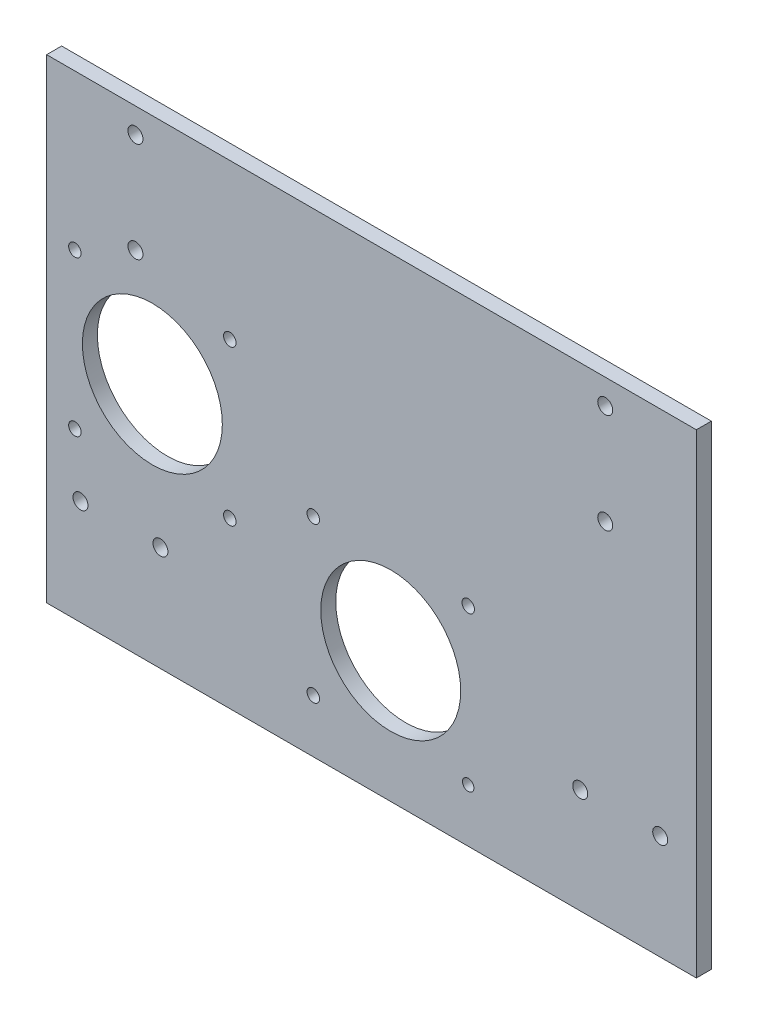
ISO-10303-21;
HEADER;
FILE_DESCRIPTION(('STEP AP214'),'2;1');
FILE_NAME('part.step','',(''),(''),'','','');
FILE_SCHEMA(('AUTOMOTIVE_DESIGN { 1 0 10303 214 1 1 1 1 }'));
ENDSEC;
DATA;
#1=APPLICATION_CONTEXT('core data for automotive mechanical design processes');
#2=APPLICATION_PROTOCOL_DEFINITION('international standard','automotive_design',2000,#1);
#3=PRODUCT_CONTEXT('',#1,'mechanical');
#4=PRODUCT('Part','Part','',(#3));
#5=PRODUCT_RELATED_PRODUCT_CATEGORY('part','',(#4));
#6=PRODUCT_DEFINITION_FORMATION('','',#4);
#7=PRODUCT_DEFINITION_CONTEXT('part definition',#1,'design');
#8=PRODUCT_DEFINITION('design','',#6,#7);
#9=PRODUCT_DEFINITION_SHAPE('','',#8);
#10=(LENGTH_UNIT() NAMED_UNIT(*) SI_UNIT(.MILLI.,.METRE.));
#11=(NAMED_UNIT(*) PLANE_ANGLE_UNIT() SI_UNIT($,.RADIAN.));
#12=(NAMED_UNIT(*) SI_UNIT($,.STERADIAN.) SOLID_ANGLE_UNIT());
#13=UNCERTAINTY_MEASURE_WITH_UNIT(LENGTH_MEASURE(1.E-05),#10,'distance_accuracy_value','');
#14=(GEOMETRIC_REPRESENTATION_CONTEXT(3) GLOBAL_UNCERTAINTY_ASSIGNED_CONTEXT((#13)) GLOBAL_UNIT_ASSIGNED_CONTEXT((#10,
#11,#12)) REPRESENTATION_CONTEXT('',''));
#15=CARTESIAN_POINT('',(0.,0.,0.));
#16=DIRECTION('',(0.,0.,1.));
#17=DIRECTION('',(1.,0.,0.));
#18=AXIS2_PLACEMENT_3D('',#15,#16,#17);
#19=CARTESIAN_POINT('',(-65.,-47.5,3.));
#20=DIRECTION('',(1.,0.,0.));
#21=DIRECTION('',(0.,0.,-1.));
#22=AXIS2_PLACEMENT_3D('',#19,#20,#21);
#23=PLANE('',#22);
#24=DIRECTION('',(0.,-1.,0.));
#25=VECTOR('',#24,1.);
#26=CARTESIAN_POINT('',(-65.,-47.5,0.));
#27=LINE('',#26,#25);
#28=CARTESIAN_POINT('',(-65.,47.5,0.));
#29=VERTEX_POINT('',#28);
#30=CARTESIAN_POINT('',(-65.,-47.5,0.));
#31=VERTEX_POINT('',#30);
#32=EDGE_CURVE('E113',#29,#31,#27,.T.);
#33=ORIENTED_EDGE('',*,*,#32,.T.);
#34=DIRECTION('',(0.,0.,-1.));
#35=VECTOR('',#34,1.);
#36=CARTESIAN_POINT('',(-65.,-47.5,3.));
#37=LINE('',#36,#35);
#38=CARTESIAN_POINT('',(-65.,-47.5,3.));
#39=VERTEX_POINT('',#38);
#40=EDGE_CURVE('E11',#39,#31,#37,.T.);
#41=ORIENTED_EDGE('',*,*,#40,.F.);
#42=DIRECTION('',(0.,-1.,0.));
#43=VECTOR('',#42,1.);
#44=CARTESIAN_POINT('',(-65.,-47.5,3.));
#45=LINE('',#44,#43);
#46=CARTESIAN_POINT('',(-65.,47.5,3.));
#47=VERTEX_POINT('',#46);
#48=EDGE_CURVE('E96',#47,#39,#45,.T.);
#49=ORIENTED_EDGE('',*,*,#48,.F.);
#50=DIRECTION('',(0.,0.,-1.));
#51=VECTOR('',#50,1.);
#52=CARTESIAN_POINT('',(-65.,47.5,3.));
#53=LINE('',#52,#51);
#54=EDGE_CURVE('E109',#47,#29,#53,.T.);
#55=ORIENTED_EDGE('',*,*,#54,.T.);
#56=EDGE_LOOP('',(#33,#41,#49,#55));
#57=FACE_BOUND('',#56,.T.);
#58=ADVANCED_FACE('F42',(#57),#23,.F.);
#59=CARTESIAN_POINT('',(65.,-47.5,3.));
#60=DIRECTION('',(0.,1.,0.));
#61=DIRECTION('',(-1.,0.,0.));
#62=AXIS2_PLACEMENT_3D('',#59,#60,#61);
#63=PLANE('',#62);
#64=DIRECTION('',(1.,0.,0.));
#65=VECTOR('',#64,1.);
#66=CARTESIAN_POINT('',(65.,-47.5,0.));
#67=LINE('',#66,#65);
#68=CARTESIAN_POINT('',(65.,-47.5,0.));
#69=VERTEX_POINT('',#68);
#70=EDGE_CURVE('E101',#31,#69,#67,.T.);
#71=ORIENTED_EDGE('',*,*,#70,.T.);
#72=DIRECTION('',(0.,0.,-1.));
#73=VECTOR('',#72,1.);
#74=CARTESIAN_POINT('',(65.,-47.5,3.));
#75=LINE('',#74,#73);
#76=CARTESIAN_POINT('',(65.,-47.5,3.));
#77=VERTEX_POINT('',#76);
#78=EDGE_CURVE('E52',#77,#69,#75,.T.);
#79=ORIENTED_EDGE('',*,*,#78,.F.);
#80=DIRECTION('',(1.,0.,0.));
#81=VECTOR('',#80,1.);
#82=CARTESIAN_POINT('',(65.,-47.5,3.));
#83=LINE('',#82,#81);
#84=EDGE_CURVE('E91',#39,#77,#83,.T.);
#85=ORIENTED_EDGE('',*,*,#84,.F.);
#86=ORIENTED_EDGE('',*,*,#40,.T.);
#87=EDGE_LOOP('',(#71,#79,#85,#86));
#88=FACE_BOUND('',#87,.T.);
#89=ADVANCED_FACE('F100',(#88),#63,.F.);
#90=CARTESIAN_POINT('',(65.,-47.5,3.));
#91=DIRECTION('',(-1.,0.,0.));
#92=DIRECTION('',(0.,0.,1.));
#93=AXIS2_PLACEMENT_3D('',#90,#91,#92);
#94=PLANE('',#93);
#95=DIRECTION('',(0.,1.,0.));
#96=VECTOR('',#95,1.);
#97=CARTESIAN_POINT('',(65.,-47.5,0.));
#98=LINE('',#97,#96);
#99=CARTESIAN_POINT('',(65.,47.5,0.));
#100=VERTEX_POINT('',#99);
#101=EDGE_CURVE('E78',#69,#100,#98,.T.);
#102=ORIENTED_EDGE('',*,*,#101,.T.);
#103=DIRECTION('',(0.,0.,-1.));
#104=VECTOR('',#103,1.);
#105=CARTESIAN_POINT('',(65.,47.5,3.));
#106=LINE('',#105,#104);
#107=CARTESIAN_POINT('',(65.,47.5,3.));
#108=VERTEX_POINT('',#107);
#109=EDGE_CURVE('E103',#108,#100,#106,.T.);
#110=ORIENTED_EDGE('',*,*,#109,.F.);
#111=DIRECTION('',(0.,1.,0.));
#112=VECTOR('',#111,1.);
#113=CARTESIAN_POINT('',(65.,-47.5,3.));
#114=LINE('',#113,#112);
#115=EDGE_CURVE('E94',#77,#108,#114,.T.);
#116=ORIENTED_EDGE('',*,*,#115,.F.);
#117=ORIENTED_EDGE('',*,*,#78,.T.);
#118=EDGE_LOOP('',(#102,#110,#116,#117));
#119=FACE_BOUND('',#118,.T.);
#120=ADVANCED_FACE('F105',(#119),#94,.F.);
#121=CARTESIAN_POINT('',(65.,47.5,3.));
#122=DIRECTION('',(0.,-1.,0.));
#123=DIRECTION('',(1.,0.,0.));
#124=AXIS2_PLACEMENT_3D('',#121,#122,#123);
#125=PLANE('',#124);
#126=DIRECTION('',(-1.,0.,0.));
#127=VECTOR('',#126,1.);
#128=CARTESIAN_POINT('',(65.,47.5,0.));
#129=LINE('',#128,#127);
#130=EDGE_CURVE('E84',#100,#29,#129,.T.);
#131=ORIENTED_EDGE('',*,*,#130,.T.);
#132=ORIENTED_EDGE('',*,*,#54,.F.);
#133=DIRECTION('',(-1.,0.,0.));
#134=VECTOR('',#133,1.);
#135=CARTESIAN_POINT('',(65.,47.5,3.));
#136=LINE('',#135,#134);
#137=EDGE_CURVE('E61',#108,#47,#136,.T.);
#138=ORIENTED_EDGE('',*,*,#137,.F.);
#139=ORIENTED_EDGE('',*,*,#109,.T.);
#140=EDGE_LOOP('',(#131,#132,#138,#139));
#141=FACE_BOUND('',#140,.T.);
#142=ADVANCED_FACE('F252',(#141),#125,.F.);
#143=CARTESIAN_POINT('',(0.,0.,3.));
#144=DIRECTION('',(0.,0.,1.));
#145=DIRECTION('',(1.,0.,0.));
#146=AXIS2_PLACEMENT_3D('',#143,#144,#145);
#147=PLANE('',#146);
#148=CARTESIAN_POINT('',(-11.65,-5.85000000000109,3.));
#149=DIRECTION('',(0.,0.,1.));
#150=DIRECTION('',(1.,0.,0.));
#151=AXIS2_PLACEMENT_3D('',#148,#149,#150);
#152=CIRCLE('',#151,1.24999999999999);
#153=CARTESIAN_POINT('',(-10.4,-5.85000000000109,3.));
#154=VERTEX_POINT('',#153);
#155=EDGE_CURVE('E539',#154,#154,#152,.T.);
#156=ORIENTED_EDGE('',*,*,#155,.F.);
#157=EDGE_LOOP('',(#156));
#158=FACE_BOUND('',#157,.T.);
#159=CARTESIAN_POINT('',(-28.35,-14.5033003747531,3.));
#160=DIRECTION('',(0.,0.,1.));
#161=DIRECTION('',(1.,0.,0.));
#162=AXIS2_PLACEMENT_3D('',#159,#160,#161);
#163=CIRCLE('',#162,1.24999999999999);
#164=CARTESIAN_POINT('',(-27.1,-14.5033003747531,3.));
#165=VERTEX_POINT('',#164);
#166=EDGE_CURVE('E541',#165,#165,#163,.T.);
#167=ORIENTED_EDGE('',*,*,#166,.F.);
#168=EDGE_LOOP('',(#167));
#169=FACE_BOUND('',#168,.T.);
#170=CARTESIAN_POINT('',(-59.35,-14.5033003747531,3.));
#171=DIRECTION('',(0.,0.,1.));
#172=DIRECTION('',(1.,0.,0.));
#173=AXIS2_PLACEMENT_3D('',#170,#171,#172);
#174=CIRCLE('',#173,1.24999999999999);
#175=CARTESIAN_POINT('',(-58.1,-14.5033003747531,3.));
#176=VERTEX_POINT('',#175);
#177=EDGE_CURVE('E547',#176,#176,#174,.T.);
#178=ORIENTED_EDGE('',*,*,#177,.F.);
#179=EDGE_LOOP('',(#178));
#180=FACE_BOUND('',#179,.T.);
#181=CARTESIAN_POINT('',(-28.35,16.4966996252469,3.));
#182=DIRECTION('',(0.,0.,1.));
#183=DIRECTION('',(1.,0.,0.));
#184=AXIS2_PLACEMENT_3D('',#181,#182,#183);
#185=CIRCLE('',#184,1.24999999999999);
#186=CARTESIAN_POINT('',(-27.1,16.4966996252469,3.));
#187=VERTEX_POINT('',#186);
#188=EDGE_CURVE('E554',#187,#187,#185,.T.);
#189=ORIENTED_EDGE('',*,*,#188,.F.);
#190=EDGE_LOOP('',(#189));
#191=FACE_BOUND('',#190,.T.);
#192=CARTESIAN_POINT('',(19.35,-5.85000000000108,3.));
#193=DIRECTION('',(0.,0.,1.));
#194=DIRECTION('',(1.,0.,0.));
#195=AXIS2_PLACEMENT_3D('',#192,#193,#194);
#196=CIRCLE('',#195,1.24999999999999);
#197=CARTESIAN_POINT('',(20.6,-5.85000000000108,3.));
#198=VERTEX_POINT('',#197);
#199=EDGE_CURVE('E542',#198,#198,#196,.T.);
#200=ORIENTED_EDGE('',*,*,#199,.F.);
#201=EDGE_LOOP('',(#200));
#202=FACE_BOUND('',#201,.T.);
#203=CARTESIAN_POINT('',(19.35,-36.8500000000011,3.));
#204=DIRECTION('',(0.,0.,1.));
#205=DIRECTION('',(1.,0.,0.));
#206=AXIS2_PLACEMENT_3D('',#203,#204,#205);
#207=CIRCLE('',#206,1.1455222308157);
#208=CARTESIAN_POINT('',(20.4955222308157,-36.8500000000011,3.));
#209=VERTEX_POINT('',#208);
#210=EDGE_CURVE('E550',#209,#209,#207,.T.);
#211=ORIENTED_EDGE('',*,*,#210,.F.);
#212=EDGE_LOOP('',(#211));
#213=FACE_BOUND('',#212,.T.);
#214=CARTESIAN_POINT('',(-11.65,-36.8500000000011,3.));
#215=DIRECTION('',(0.,0.,1.));
#216=DIRECTION('',(1.,0.,0.));
#217=AXIS2_PLACEMENT_3D('',#214,#215,#216);
#218=CIRCLE('',#217,1.25);
#219=CARTESIAN_POINT('',(-10.4,-36.8500000000011,3.));
#220=VERTEX_POINT('',#219);
#221=EDGE_CURVE('E616',#220,#220,#218,.T.);
#222=ORIENTED_EDGE('',*,*,#221,.F.);
#223=EDGE_LOOP('',(#222));
#224=FACE_BOUND('',#223,.T.);
#225=CARTESIAN_POINT('',(-59.35,16.4966996252469,3.));
#226=DIRECTION('',(0.,0.,1.));
#227=DIRECTION('',(1.,0.,0.));
#228=AXIS2_PLACEMENT_3D('',#225,#226,#227);
#229=CIRCLE('',#228,1.24999999999999);
#230=CARTESIAN_POINT('',(-58.1,16.4966996252469,3.));
#231=VERTEX_POINT('',#230);
#232=EDGE_CURVE('E133',#231,#231,#229,.T.);
#233=ORIENTED_EDGE('',*,*,#232,.F.);
#234=EDGE_LOOP('',(#233));
#235=FACE_BOUND('',#234,.T.);
#236=CARTESIAN_POINT('',(3.84999999999999,-21.3500000000588,3.));
#237=DIRECTION('',(0.,0.,1.));
#238=DIRECTION('',(1.,0.,0.));
#239=AXIS2_PLACEMENT_3D('',#236,#237,#238);
#240=CIRCLE('',#239,14.);
#241=CARTESIAN_POINT('',(17.85,-21.3500000000588,3.));
#242=VERTEX_POINT('',#241);
#243=EDGE_CURVE('E177',#242,#242,#240,.T.);
#244=ORIENTED_EDGE('',*,*,#243,.F.);
#245=EDGE_LOOP('',(#244));
#246=FACE_BOUND('',#245,.T.);
#247=CARTESIAN_POINT('',(-43.85,0.99669962524906,3.));
#248=DIRECTION('',(0.,0.,1.));
#249=DIRECTION('',(1.,0.,0.));
#250=AXIS2_PLACEMENT_3D('',#247,#248,#249);
#251=CIRCLE('',#250,14.);
#252=CARTESIAN_POINT('',(-29.85,0.99669962524906,3.));
#253=VERTEX_POINT('',#252);
#254=EDGE_CURVE('E170',#253,#253,#251,.T.);
#255=ORIENTED_EDGE('',*,*,#254,.F.);
#256=EDGE_LOOP('',(#255));
#257=FACE_BOUND('',#256,.T.);
#258=CARTESIAN_POINT('',(46.7671126155352,22.5,3.));
#259=DIRECTION('',(0.,0.,1.));
#260=DIRECTION('',(1.,0.,0.));
#261=AXIS2_PLACEMENT_3D('',#258,#259,#260);
#262=CIRCLE('',#261,1.5);
#263=CARTESIAN_POINT('',(48.2671126155352,22.5,3.));
#264=VERTEX_POINT('',#263);
#265=EDGE_CURVE('E209',#264,#264,#262,.T.);
#266=ORIENTED_EDGE('',*,*,#265,.F.);
#267=EDGE_LOOP('',(#266));
#268=FACE_BOUND('',#267,.T.);
#269=CARTESIAN_POINT('',(-47.2328873844649,42.5,3.));
#270=DIRECTION('',(0.,0.,1.));
#271=DIRECTION('',(1.,0.,0.));
#272=AXIS2_PLACEMENT_3D('',#269,#270,#271);
#273=CIRCLE('',#272,1.5);
#274=CARTESIAN_POINT('',(-45.7328873844649,42.5,3.));
#275=VERTEX_POINT('',#274);
#276=EDGE_CURVE('E205',#275,#275,#273,.T.);
#277=ORIENTED_EDGE('',*,*,#276,.F.);
#278=EDGE_LOOP('',(#277));
#279=FACE_BOUND('',#278,.T.);
#280=CARTESIAN_POINT('',(-47.2328873844649,22.5,3.));
#281=DIRECTION('',(0.,0.,1.));
#282=DIRECTION('',(1.,0.,0.));
#283=AXIS2_PLACEMENT_3D('',#280,#281,#282);
#284=CIRCLE('',#283,1.5);
#285=CARTESIAN_POINT('',(-45.7328873844649,22.5,3.));
#286=VERTEX_POINT('',#285);
#287=EDGE_CURVE('E201',#286,#286,#284,.T.);
#288=ORIENTED_EDGE('',*,*,#287,.F.);
#289=EDGE_LOOP('',(#288));
#290=FACE_BOUND('',#289,.T.);
#291=CARTESIAN_POINT('',(46.7671126155352,42.5,3.));
#292=DIRECTION('',(0.,0.,1.));
#293=DIRECTION('',(1.,0.,0.));
#294=AXIS2_PLACEMENT_3D('',#291,#292,#293);
#295=CIRCLE('',#294,1.5);
#296=CARTESIAN_POINT('',(48.2671126155352,42.5,3.));
#297=VERTEX_POINT('',#296);
#298=EDGE_CURVE('E197',#297,#297,#295,.T.);
#299=ORIENTED_EDGE('',*,*,#298,.F.);
#300=EDGE_LOOP('',(#299));
#301=FACE_BOUND('',#300,.T.);
#302=CARTESIAN_POINT('',(57.7671126155351,-26.5,3.));
#303=DIRECTION('',(0.,0.,1.));
#304=DIRECTION('',(1.,0.,0.));
#305=AXIS2_PLACEMENT_3D('',#302,#303,#304);
#306=CIRCLE('',#305,1.5);
#307=CARTESIAN_POINT('',(59.2671126155351,-26.5,3.));
#308=VERTEX_POINT('',#307);
#309=EDGE_CURVE('E117',#308,#308,#306,.T.);
#310=ORIENTED_EDGE('',*,*,#309,.F.);
#311=EDGE_LOOP('',(#310));
#312=FACE_BOUND('',#311,.T.);
#313=CARTESIAN_POINT('',(41.7671126155351,-26.5,3.));
#314=DIRECTION('',(0.,0.,1.));
#315=DIRECTION('',(1.,0.,0.));
#316=AXIS2_PLACEMENT_3D('',#313,#314,#315);
#317=CIRCLE('',#316,1.5);
#318=CARTESIAN_POINT('',(43.2671126155351,-26.5,3.));
#319=VERTEX_POINT('',#318);
#320=EDGE_CURVE('E237',#319,#319,#317,.T.);
#321=ORIENTED_EDGE('',*,*,#320,.F.);
#322=EDGE_LOOP('',(#321));
#323=FACE_BOUND('',#322,.T.);
#324=CARTESIAN_POINT('',(-42.2328873844649,-26.5,3.));
#325=DIRECTION('',(0.,0.,1.));
#326=DIRECTION('',(1.,0.,0.));
#327=AXIS2_PLACEMENT_3D('',#324,#325,#326);
#328=CIRCLE('',#327,1.5);
#329=CARTESIAN_POINT('',(-40.7328873844649,-26.5,3.));
#330=VERTEX_POINT('',#329);
#331=EDGE_CURVE('E233',#330,#330,#328,.T.);
#332=ORIENTED_EDGE('',*,*,#331,.F.);
#333=EDGE_LOOP('',(#332));
#334=FACE_BOUND('',#333,.T.);
#335=CARTESIAN_POINT('',(-58.2328873844649,-26.5,3.));
#336=DIRECTION('',(0.,0.,1.));
#337=DIRECTION('',(1.,0.,0.));
#338=AXIS2_PLACEMENT_3D('',#335,#336,#337);
#339=CIRCLE('',#338,1.5);
#340=CARTESIAN_POINT('',(-56.7328873844649,-26.5,3.));
#341=VERTEX_POINT('',#340);
#342=EDGE_CURVE('E218',#341,#341,#339,.T.);
#343=ORIENTED_EDGE('',*,*,#342,.F.);
#344=EDGE_LOOP('',(#343));
#345=FACE_BOUND('',#344,.T.);
#346=ORIENTED_EDGE('',*,*,#48,.T.);
#347=ORIENTED_EDGE('',*,*,#84,.T.);
#348=ORIENTED_EDGE('',*,*,#115,.T.);
#349=ORIENTED_EDGE('',*,*,#137,.T.);
#350=EDGE_LOOP('',(#346,#347,#348,#349));
#351=FACE_BOUND('',#350,.T.);
#352=ADVANCED_FACE('F92',(#158,#169,#180,#191,#202,#213,#224,#235,#246,#257,#268,#279,#290,#301,
#312,#323,#334,#345,#351),#147,.T.);
#353=CARTESIAN_POINT('',(0.,0.,0.));
#354=DIRECTION('',(0.,0.,1.));
#355=DIRECTION('',(1.,0.,0.));
#356=AXIS2_PLACEMENT_3D('',#353,#354,#355);
#357=PLANE('',#356);
#358=CARTESIAN_POINT('',(-11.65,-5.85000000000109,0.));
#359=DIRECTION('',(0.,0.,1.));
#360=DIRECTION('',(1.,0.,0.));
#361=AXIS2_PLACEMENT_3D('',#358,#359,#360);
#362=CIRCLE('',#361,1.24999999999999);
#363=CARTESIAN_POINT('',(-10.4,-5.85000000000109,0.));
#364=VERTEX_POINT('',#363);
#365=EDGE_CURVE('E45',#364,#364,#362,.T.);
#366=ORIENTED_EDGE('',*,*,#365,.T.);
#367=EDGE_LOOP('',(#366));
#368=FACE_BOUND('',#367,.T.);
#369=CARTESIAN_POINT('',(-28.35,-14.5033003747531,0.));
#370=DIRECTION('',(0.,0.,1.));
#371=DIRECTION('',(1.,0.,0.));
#372=AXIS2_PLACEMENT_3D('',#369,#370,#371);
#373=CIRCLE('',#372,1.24999999999999);
#374=CARTESIAN_POINT('',(-27.1,-14.5033003747531,0.));
#375=VERTEX_POINT('',#374);
#376=EDGE_CURVE('E152',#375,#375,#373,.T.);
#377=ORIENTED_EDGE('',*,*,#376,.T.);
#378=EDGE_LOOP('',(#377));
#379=FACE_BOUND('',#378,.T.);
#380=CARTESIAN_POINT('',(-59.35,-14.5033003747531,0.));
#381=DIRECTION('',(0.,0.,1.));
#382=DIRECTION('',(1.,0.,0.));
#383=AXIS2_PLACEMENT_3D('',#380,#381,#382);
#384=CIRCLE('',#383,1.24999999999999);
#385=CARTESIAN_POINT('',(-58.1,-14.5033003747531,0.));
#386=VERTEX_POINT('',#385);
#387=EDGE_CURVE('E149',#386,#386,#384,.T.);
#388=ORIENTED_EDGE('',*,*,#387,.T.);
#389=EDGE_LOOP('',(#388));
#390=FACE_BOUND('',#389,.T.);
#391=CARTESIAN_POINT('',(-28.35,16.4966996252469,0.));
#392=DIRECTION('',(0.,0.,1.));
#393=DIRECTION('',(1.,0.,0.));
#394=AXIS2_PLACEMENT_3D('',#391,#392,#393);
#395=CIRCLE('',#394,1.24999999999999);
#396=CARTESIAN_POINT('',(-27.1,16.4966996252469,0.));
#397=VERTEX_POINT('',#396);
#398=EDGE_CURVE('E145',#397,#397,#395,.T.);
#399=ORIENTED_EDGE('',*,*,#398,.T.);
#400=EDGE_LOOP('',(#399));
#401=FACE_BOUND('',#400,.T.);
#402=CARTESIAN_POINT('',(19.35,-5.85000000000108,0.));
#403=DIRECTION('',(0.,0.,1.));
#404=DIRECTION('',(1.,0.,0.));
#405=AXIS2_PLACEMENT_3D('',#402,#403,#404);
#406=CIRCLE('',#405,1.24999999999999);
#407=CARTESIAN_POINT('',(20.6,-5.85000000000108,0.));
#408=VERTEX_POINT('',#407);
#409=EDGE_CURVE('E141',#408,#408,#406,.T.);
#410=ORIENTED_EDGE('',*,*,#409,.T.);
#411=EDGE_LOOP('',(#410));
#412=FACE_BOUND('',#411,.T.);
#413=CARTESIAN_POINT('',(19.35,-36.8500000000011,0.));
#414=DIRECTION('',(0.,0.,1.));
#415=DIRECTION('',(1.,0.,0.));
#416=AXIS2_PLACEMENT_3D('',#413,#414,#415);
#417=CIRCLE('',#416,1.1455222308157);
#418=CARTESIAN_POINT('',(20.4955222308157,-36.8500000000011,0.));
#419=VERTEX_POINT('',#418);
#420=EDGE_CURVE('E137',#419,#419,#417,.T.);
#421=ORIENTED_EDGE('',*,*,#420,.T.);
#422=EDGE_LOOP('',(#421));
#423=FACE_BOUND('',#422,.T.);
#424=CARTESIAN_POINT('',(-11.65,-36.8500000000011,0.));
#425=DIRECTION('',(0.,0.,1.));
#426=DIRECTION('',(1.,0.,0.));
#427=AXIS2_PLACEMENT_3D('',#424,#425,#426);
#428=CIRCLE('',#427,1.25);
#429=CARTESIAN_POINT('',(-10.4,-36.8500000000011,0.));
#430=VERTEX_POINT('',#429);
#431=EDGE_CURVE('E132',#430,#430,#428,.T.);
#432=ORIENTED_EDGE('',*,*,#431,.T.);
#433=EDGE_LOOP('',(#432));
#434=FACE_BOUND('',#433,.T.);
#435=CARTESIAN_POINT('',(-59.35,16.4966996252469,0.));
#436=DIRECTION('',(0.,0.,1.));
#437=DIRECTION('',(1.,0.,0.));
#438=AXIS2_PLACEMENT_3D('',#435,#436,#437);
#439=CIRCLE('',#438,1.24999999999999);
#440=CARTESIAN_POINT('',(-58.1,16.4966996252469,0.));
#441=VERTEX_POINT('',#440);
#442=EDGE_CURVE('E128',#441,#441,#439,.T.);
#443=ORIENTED_EDGE('',*,*,#442,.T.);
#444=EDGE_LOOP('',(#443));
#445=FACE_BOUND('',#444,.T.);
#446=CARTESIAN_POINT('',(3.84999999999999,-21.3500000000588,0.));
#447=DIRECTION('',(0.,0.,-1.));
#448=DIRECTION('',(-1.,0.,0.));
#449=AXIS2_PLACEMENT_3D('',#446,#447,#448);
#450=CIRCLE('',#449,14.);
#451=CARTESIAN_POINT('',(-10.15,-21.3500000000588,0.));
#452=VERTEX_POINT('',#451);
#453=EDGE_CURVE('E164',#452,#452,#450,.T.);
#454=ORIENTED_EDGE('',*,*,#453,.F.);
#455=EDGE_LOOP('',(#454));
#456=FACE_BOUND('',#455,.T.);
#457=CARTESIAN_POINT('',(-43.85,0.99669962524906,0.));
#458=DIRECTION('',(0.,0.,-1.));
#459=DIRECTION('',(-1.,0.,0.));
#460=AXIS2_PLACEMENT_3D('',#457,#458,#459);
#461=CIRCLE('',#460,14.);
#462=CARTESIAN_POINT('',(-57.85,0.99669962524906,0.));
#463=VERTEX_POINT('',#462);
#464=EDGE_CURVE('E159',#463,#463,#461,.T.);
#465=ORIENTED_EDGE('',*,*,#464,.F.);
#466=EDGE_LOOP('',(#465));
#467=FACE_BOUND('',#466,.T.);
#468=CARTESIAN_POINT('',(46.7671126155352,22.5,0.));
#469=DIRECTION('',(0.,0.,-1.));
#470=DIRECTION('',(-1.,0.,0.));
#471=AXIS2_PLACEMENT_3D('',#468,#469,#470);
#472=CIRCLE('',#471,1.5);
#473=CARTESIAN_POINT('',(45.2671126155352,22.5,0.));
#474=VERTEX_POINT('',#473);
#475=EDGE_CURVE('E186',#474,#474,#472,.T.);
#476=ORIENTED_EDGE('',*,*,#475,.F.);
#477=EDGE_LOOP('',(#476));
#478=FACE_BOUND('',#477,.T.);
#479=CARTESIAN_POINT('',(-47.2328873844649,42.5,0.));
#480=DIRECTION('',(0.,0.,-1.));
#481=DIRECTION('',(-1.,0.,0.));
#482=AXIS2_PLACEMENT_3D('',#479,#480,#481);
#483=CIRCLE('',#482,1.5);
#484=CARTESIAN_POINT('',(-48.7328873844649,42.5,0.));
#485=VERTEX_POINT('',#484);
#486=EDGE_CURVE('E185',#485,#485,#483,.T.);
#487=ORIENTED_EDGE('',*,*,#486,.F.);
#488=EDGE_LOOP('',(#487));
#489=FACE_BOUND('',#488,.T.);
#490=CARTESIAN_POINT('',(-47.2328873844649,22.5,0.));
#491=DIRECTION('',(0.,0.,-1.));
#492=DIRECTION('',(-1.,0.,0.));
#493=AXIS2_PLACEMENT_3D('',#490,#491,#492);
#494=CIRCLE('',#493,1.5);
#495=CARTESIAN_POINT('',(-48.7328873844649,22.5,0.));
#496=VERTEX_POINT('',#495);
#497=EDGE_CURVE('E181',#496,#496,#494,.T.);
#498=ORIENTED_EDGE('',*,*,#497,.F.);
#499=EDGE_LOOP('',(#498));
#500=FACE_BOUND('',#499,.T.);
#501=CARTESIAN_POINT('',(46.7671126155352,42.5,0.));
#502=DIRECTION('',(0.,0.,-1.));
#503=DIRECTION('',(-1.,0.,0.));
#504=AXIS2_PLACEMENT_3D('',#501,#502,#503);
#505=CIRCLE('',#504,1.5);
#506=CARTESIAN_POINT('',(45.2671126155352,42.5,0.));
#507=VERTEX_POINT('',#506);
#508=EDGE_CURVE('E190',#507,#507,#505,.T.);
#509=ORIENTED_EDGE('',*,*,#508,.F.);
#510=EDGE_LOOP('',(#509));
#511=FACE_BOUND('',#510,.T.);
#512=CARTESIAN_POINT('',(57.7671126155351,-26.5,0.));
#513=DIRECTION('',(0.,0.,-1.));
#514=DIRECTION('',(-1.,0.,0.));
#515=AXIS2_PLACEMENT_3D('',#512,#513,#514);
#516=CIRCLE('',#515,1.5);
#517=CARTESIAN_POINT('',(56.2671126155351,-26.5,0.));
#518=VERTEX_POINT('',#517);
#519=EDGE_CURVE('E214',#518,#518,#516,.T.);
#520=ORIENTED_EDGE('',*,*,#519,.F.);
#521=EDGE_LOOP('',(#520));
#522=FACE_BOUND('',#521,.T.);
#523=CARTESIAN_POINT('',(41.7671126155351,-26.5,0.));
#524=DIRECTION('',(0.,0.,-1.));
#525=DIRECTION('',(-1.,0.,0.));
#526=AXIS2_PLACEMENT_3D('',#523,#524,#525);
#527=CIRCLE('',#526,1.5);
#528=CARTESIAN_POINT('',(40.2671126155351,-26.5,0.));
#529=VERTEX_POINT('',#528);
#530=EDGE_CURVE('E219',#529,#529,#527,.T.);
#531=ORIENTED_EDGE('',*,*,#530,.F.);
#532=EDGE_LOOP('',(#531));
#533=FACE_BOUND('',#532,.T.);
#534=CARTESIAN_POINT('',(-42.2328873844649,-26.5,0.));
#535=DIRECTION('',(0.,0.,-1.));
#536=DIRECTION('',(-1.,0.,0.));
#537=AXIS2_PLACEMENT_3D('',#534,#535,#536);
#538=CIRCLE('',#537,1.5);
#539=CARTESIAN_POINT('',(-43.7328873844649,-26.5,0.));
#540=VERTEX_POINT('',#539);
#541=EDGE_CURVE('E223',#540,#540,#538,.T.);
#542=ORIENTED_EDGE('',*,*,#541,.F.);
#543=EDGE_LOOP('',(#542));
#544=FACE_BOUND('',#543,.T.);
#545=CARTESIAN_POINT('',(-58.2328873844649,-26.5,0.));
#546=DIRECTION('',(0.,0.,-1.));
#547=DIRECTION('',(-1.,0.,0.));
#548=AXIS2_PLACEMENT_3D('',#545,#546,#547);
#549=CIRCLE('',#548,1.5);
#550=CARTESIAN_POINT('',(-59.7328873844649,-26.5,0.));
#551=VERTEX_POINT('',#550);
#552=EDGE_CURVE('E213',#551,#551,#549,.T.);
#553=ORIENTED_EDGE('',*,*,#552,.F.);
#554=EDGE_LOOP('',(#553));
#555=FACE_BOUND('',#554,.T.);
#556=ORIENTED_EDGE('',*,*,#32,.F.);
#557=ORIENTED_EDGE('',*,*,#130,.F.);
#558=ORIENTED_EDGE('',*,*,#101,.F.);
#559=ORIENTED_EDGE('',*,*,#70,.F.);
#560=EDGE_LOOP('',(#556,#557,#558,#559));
#561=FACE_BOUND('',#560,.T.);
#562=ADVANCED_FACE('F251',(#368,#379,#390,#401,#412,#423,#434,#445,#456,#467,#478,#489,#500,
#511,#522,#533,#544,#555,#561),#357,.F.);
#563=CARTESIAN_POINT('',(-58.2328873844649,-26.5,10.));
#564=DIRECTION('',(0.,0.,-1.));
#565=DIRECTION('',(-1.,0.,0.));
#566=AXIS2_PLACEMENT_3D('',#563,#564,#565);
#567=CYLINDRICAL_SURFACE('',#566,1.5);
#568=ORIENTED_EDGE('',*,*,#342,.T.);
#569=EDGE_LOOP('',(#568));
#570=FACE_BOUND('',#569,.T.);
#571=ORIENTED_EDGE('',*,*,#552,.T.);
#572=EDGE_LOOP('',(#571));
#573=FACE_BOUND('',#572,.T.);
#574=ADVANCED_FACE('F261',(#570,#573),#567,.F.);
#575=CARTESIAN_POINT('',(-42.2328873844649,-26.5,10.));
#576=DIRECTION('',(0.,0.,-1.));
#577=DIRECTION('',(-1.,0.,0.));
#578=AXIS2_PLACEMENT_3D('',#575,#576,#577);
#579=CYLINDRICAL_SURFACE('',#578,1.5);
#580=ORIENTED_EDGE('',*,*,#331,.T.);
#581=EDGE_LOOP('',(#580));
#582=FACE_BOUND('',#581,.T.);
#583=ORIENTED_EDGE('',*,*,#541,.T.);
#584=EDGE_LOOP('',(#583));
#585=FACE_BOUND('',#584,.T.);
#586=ADVANCED_FACE('F264',(#582,#585),#579,.F.);
#587=CARTESIAN_POINT('',(41.7671126155351,-26.5,10.));
#588=DIRECTION('',(0.,0.,-1.));
#589=DIRECTION('',(-1.,0.,0.));
#590=AXIS2_PLACEMENT_3D('',#587,#588,#589);
#591=CYLINDRICAL_SURFACE('',#590,1.5);
#592=ORIENTED_EDGE('',*,*,#320,.T.);
#593=EDGE_LOOP('',(#592));
#594=FACE_BOUND('',#593,.T.);
#595=ORIENTED_EDGE('',*,*,#530,.T.);
#596=EDGE_LOOP('',(#595));
#597=FACE_BOUND('',#596,.T.);
#598=ADVANCED_FACE('F313',(#594,#597),#591,.F.);
#599=CARTESIAN_POINT('',(57.7671126155351,-26.5,10.));
#600=DIRECTION('',(0.,0.,-1.));
#601=DIRECTION('',(-1.,0.,0.));
#602=AXIS2_PLACEMENT_3D('',#599,#600,#601);
#603=CYLINDRICAL_SURFACE('',#602,1.5);
#604=ORIENTED_EDGE('',*,*,#309,.T.);
#605=EDGE_LOOP('',(#604));
#606=FACE_BOUND('',#605,.T.);
#607=ORIENTED_EDGE('',*,*,#519,.T.);
#608=EDGE_LOOP('',(#607));
#609=FACE_BOUND('',#608,.T.);
#610=ADVANCED_FACE('F246',(#606,#609),#603,.F.);
#611=CARTESIAN_POINT('',(46.7671126155352,42.5,10.));
#612=DIRECTION('',(0.,0.,-1.));
#613=DIRECTION('',(-1.,0.,0.));
#614=AXIS2_PLACEMENT_3D('',#611,#612,#613);
#615=CYLINDRICAL_SURFACE('',#614,1.5);
#616=ORIENTED_EDGE('',*,*,#298,.T.);
#617=EDGE_LOOP('',(#616));
#618=FACE_BOUND('',#617,.T.);
#619=ORIENTED_EDGE('',*,*,#508,.T.);
#620=EDGE_LOOP('',(#619));
#621=FACE_BOUND('',#620,.T.);
#622=ADVANCED_FACE('F334',(#618,#621),#615,.F.);
#623=CARTESIAN_POINT('',(-47.2328873844649,22.5,10.));
#624=DIRECTION('',(0.,0.,-1.));
#625=DIRECTION('',(-1.,0.,0.));
#626=AXIS2_PLACEMENT_3D('',#623,#624,#625);
#627=CYLINDRICAL_SURFACE('',#626,1.5);
#628=ORIENTED_EDGE('',*,*,#287,.T.);
#629=EDGE_LOOP('',(#628));
#630=FACE_BOUND('',#629,.T.);
#631=ORIENTED_EDGE('',*,*,#497,.T.);
#632=EDGE_LOOP('',(#631));
#633=FACE_BOUND('',#632,.T.);
#634=ADVANCED_FACE('F344',(#630,#633),#627,.F.);
#635=CARTESIAN_POINT('',(-47.2328873844649,42.5,10.));
#636=DIRECTION('',(0.,0.,-1.));
#637=DIRECTION('',(-1.,0.,0.));
#638=AXIS2_PLACEMENT_3D('',#635,#636,#637);
#639=CYLINDRICAL_SURFACE('',#638,1.5);
#640=ORIENTED_EDGE('',*,*,#276,.T.);
#641=EDGE_LOOP('',(#640));
#642=FACE_BOUND('',#641,.T.);
#643=ORIENTED_EDGE('',*,*,#486,.T.);
#644=EDGE_LOOP('',(#643));
#645=FACE_BOUND('',#644,.T.);
#646=ADVANCED_FACE('F355',(#642,#645),#639,.F.);
#647=CARTESIAN_POINT('',(46.7671126155352,22.5,10.));
#648=DIRECTION('',(0.,0.,-1.));
#649=DIRECTION('',(-1.,0.,0.));
#650=AXIS2_PLACEMENT_3D('',#647,#648,#649);
#651=CYLINDRICAL_SURFACE('',#650,1.5);
#652=ORIENTED_EDGE('',*,*,#265,.T.);
#653=EDGE_LOOP('',(#652));
#654=FACE_BOUND('',#653,.T.);
#655=ORIENTED_EDGE('',*,*,#475,.T.);
#656=EDGE_LOOP('',(#655));
#657=FACE_BOUND('',#656,.T.);
#658=ADVANCED_FACE('F366',(#654,#657),#651,.F.);
#659=CARTESIAN_POINT('',(-43.85,0.99669962524906,10.));
#660=DIRECTION('',(0.,0.,-1.));
#661=DIRECTION('',(-1.,0.,0.));
#662=AXIS2_PLACEMENT_3D('',#659,#660,#661);
#663=CYLINDRICAL_SURFACE('',#662,14.);
#664=ORIENTED_EDGE('',*,*,#254,.T.);
#665=EDGE_LOOP('',(#664));
#666=FACE_BOUND('',#665,.T.);
#667=ORIENTED_EDGE('',*,*,#464,.T.);
#668=EDGE_LOOP('',(#667));
#669=FACE_BOUND('',#668,.T.);
#670=ADVANCED_FACE('F377',(#666,#669),#663,.F.);
#671=CARTESIAN_POINT('',(3.84999999999999,-21.3500000000588,10.));
#672=DIRECTION('',(0.,0.,-1.));
#673=DIRECTION('',(-1.,0.,0.));
#674=AXIS2_PLACEMENT_3D('',#671,#672,#673);
#675=CYLINDRICAL_SURFACE('',#674,14.);
#676=ORIENTED_EDGE('',*,*,#243,.T.);
#677=EDGE_LOOP('',(#676));
#678=FACE_BOUND('',#677,.T.);
#679=ORIENTED_EDGE('',*,*,#453,.T.);
#680=EDGE_LOOP('',(#679));
#681=FACE_BOUND('',#680,.T.);
#682=ADVANCED_FACE('F388',(#678,#681),#675,.F.);
#683=CARTESIAN_POINT('',(-59.35,16.4966996252469,-7.));
#684=DIRECTION('',(0.,0.,1.));
#685=DIRECTION('',(1.,0.,0.));
#686=AXIS2_PLACEMENT_3D('',#683,#684,#685);
#687=CYLINDRICAL_SURFACE('',#686,1.24999999999999);
#688=ORIENTED_EDGE('',*,*,#232,.T.);
#689=EDGE_LOOP('',(#688));
#690=FACE_BOUND('',#689,.T.);
#691=ORIENTED_EDGE('',*,*,#442,.F.);
#692=EDGE_LOOP('',(#691));
#693=FACE_BOUND('',#692,.T.);
#694=ADVANCED_FACE('F399',(#690,#693),#687,.F.);
#695=CARTESIAN_POINT('',(-11.65,-36.8500000000011,-7.));
#696=DIRECTION('',(0.,0.,1.));
#697=DIRECTION('',(1.,0.,0.));
#698=AXIS2_PLACEMENT_3D('',#695,#696,#697);
#699=CYLINDRICAL_SURFACE('',#698,1.25);
#700=ORIENTED_EDGE('',*,*,#221,.T.);
#701=EDGE_LOOP('',(#700));
#702=FACE_BOUND('',#701,.T.);
#703=ORIENTED_EDGE('',*,*,#431,.F.);
#704=EDGE_LOOP('',(#703));
#705=FACE_BOUND('',#704,.T.);
#706=ADVANCED_FACE('F422',(#702,#705),#699,.F.);
#707=CARTESIAN_POINT('',(19.35,-36.8500000000011,-7.));
#708=DIRECTION('',(0.,0.,1.));
#709=DIRECTION('',(1.,0.,0.));
#710=AXIS2_PLACEMENT_3D('',#707,#708,#709);
#711=CYLINDRICAL_SURFACE('',#710,1.1455222308157);
#712=ORIENTED_EDGE('',*,*,#210,.T.);
#713=EDGE_LOOP('',(#712));
#714=FACE_BOUND('',#713,.T.);
#715=ORIENTED_EDGE('',*,*,#420,.F.);
#716=EDGE_LOOP('',(#715));
#717=FACE_BOUND('',#716,.T.);
#718=ADVANCED_FACE('F433',(#714,#717),#711,.F.);
#719=CARTESIAN_POINT('',(19.35,-5.85000000000108,-7.));
#720=DIRECTION('',(0.,0.,1.));
#721=DIRECTION('',(1.,0.,0.));
#722=AXIS2_PLACEMENT_3D('',#719,#720,#721);
#723=CYLINDRICAL_SURFACE('',#722,1.24999999999999);
#724=ORIENTED_EDGE('',*,*,#199,.T.);
#725=EDGE_LOOP('',(#724));
#726=FACE_BOUND('',#725,.T.);
#727=ORIENTED_EDGE('',*,*,#409,.F.);
#728=EDGE_LOOP('',(#727));
#729=FACE_BOUND('',#728,.T.);
#730=ADVANCED_FACE('F444',(#726,#729),#723,.F.);
#731=CARTESIAN_POINT('',(-28.35,16.4966996252469,-7.));
#732=DIRECTION('',(0.,0.,1.));
#733=DIRECTION('',(1.,0.,0.));
#734=AXIS2_PLACEMENT_3D('',#731,#732,#733);
#735=CYLINDRICAL_SURFACE('',#734,1.24999999999999);
#736=ORIENTED_EDGE('',*,*,#188,.T.);
#737=EDGE_LOOP('',(#736));
#738=FACE_BOUND('',#737,.T.);
#739=ORIENTED_EDGE('',*,*,#398,.F.);
#740=EDGE_LOOP('',(#739));
#741=FACE_BOUND('',#740,.T.);
#742=ADVANCED_FACE('F455',(#738,#741),#735,.F.);
#743=CARTESIAN_POINT('',(-59.35,-14.5033003747531,-7.));
#744=DIRECTION('',(0.,0.,1.));
#745=DIRECTION('',(1.,0.,0.));
#746=AXIS2_PLACEMENT_3D('',#743,#744,#745);
#747=CYLINDRICAL_SURFACE('',#746,1.24999999999999);
#748=ORIENTED_EDGE('',*,*,#177,.T.);
#749=EDGE_LOOP('',(#748));
#750=FACE_BOUND('',#749,.T.);
#751=ORIENTED_EDGE('',*,*,#387,.F.);
#752=EDGE_LOOP('',(#751));
#753=FACE_BOUND('',#752,.T.);
#754=ADVANCED_FACE('F466',(#750,#753),#747,.F.);
#755=CARTESIAN_POINT('',(-28.35,-14.5033003747531,-7.));
#756=DIRECTION('',(0.,0.,1.));
#757=DIRECTION('',(1.,0.,0.));
#758=AXIS2_PLACEMENT_3D('',#755,#756,#757);
#759=CYLINDRICAL_SURFACE('',#758,1.24999999999999);
#760=ORIENTED_EDGE('',*,*,#166,.T.);
#761=EDGE_LOOP('',(#760));
#762=FACE_BOUND('',#761,.T.);
#763=ORIENTED_EDGE('',*,*,#376,.F.);
#764=EDGE_LOOP('',(#763));
#765=FACE_BOUND('',#764,.T.);
#766=ADVANCED_FACE('F477',(#762,#765),#759,.F.);
#767=CARTESIAN_POINT('',(-11.65,-5.85000000000109,-7.));
#768=DIRECTION('',(0.,0.,1.));
#769=DIRECTION('',(1.,0.,0.));
#770=AXIS2_PLACEMENT_3D('',#767,#768,#769);
#771=CYLINDRICAL_SURFACE('',#770,1.24999999999999);
#772=ORIENTED_EDGE('',*,*,#155,.T.);
#773=EDGE_LOOP('',(#772));
#774=FACE_BOUND('',#773,.T.);
#775=ORIENTED_EDGE('',*,*,#365,.F.);
#776=EDGE_LOOP('',(#775));
#777=FACE_BOUND('',#776,.T.);
#778=ADVANCED_FACE('F488',(#774,#777),#771,.F.);
#779=CLOSED_SHELL('',(#58,#89,#120,#142,#352,#562,#574,#586,#598,#610,#622,#634,#646,#658,#670,
#682,#694,#706,#718,#730,#742,#754,#766,#778));
#780=MANIFOLD_SOLID_BREP('B2',#779);
#781=ADVANCED_BREP_SHAPE_REPRESENTATION('',(#18,#780),#14);
#782=SHAPE_DEFINITION_REPRESENTATION(#9,#781);
ENDSEC;
END-ISO-10303-21;
